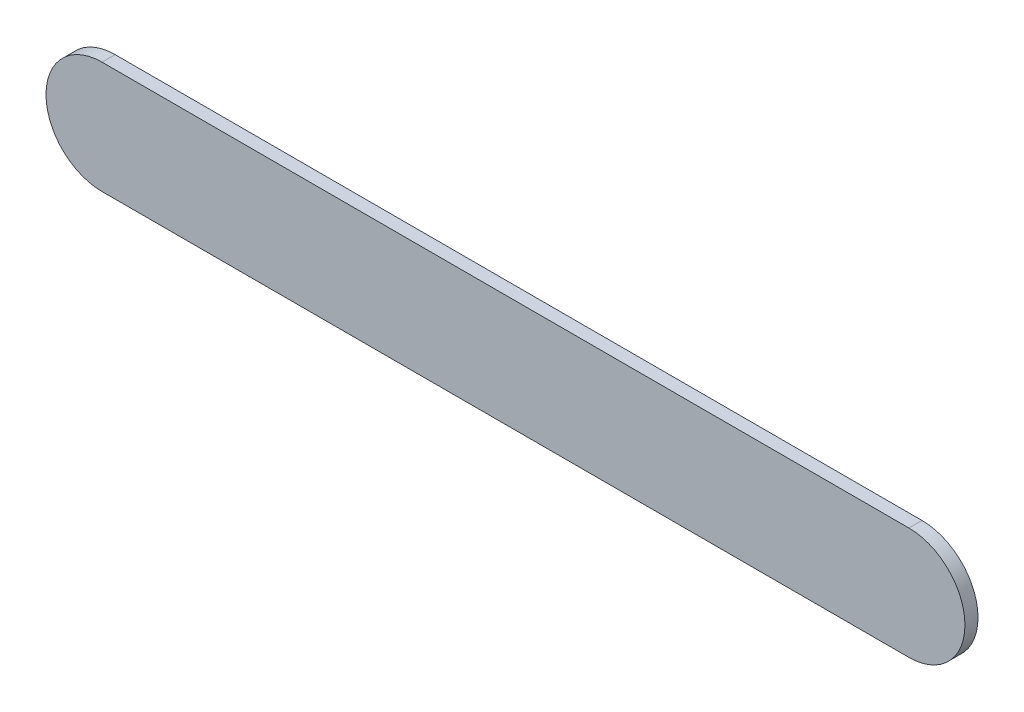
ISO-10303-21;
HEADER;
FILE_DESCRIPTION(('STEP AP214'),'2;1');
FILE_NAME('part.step','',(''),(''),'','','');
FILE_SCHEMA(('AUTOMOTIVE_DESIGN { 1 0 10303 214 1 1 1 1 }'));
ENDSEC;
DATA;
#1=APPLICATION_CONTEXT('core data for automotive mechanical design processes');
#2=APPLICATION_PROTOCOL_DEFINITION('international standard','automotive_design',2000,#1);
#3=PRODUCT_CONTEXT('',#1,'mechanical');
#4=PRODUCT('Part','Part','',(#3));
#5=PRODUCT_RELATED_PRODUCT_CATEGORY('part','',(#4));
#6=PRODUCT_DEFINITION_FORMATION('','',#4);
#7=PRODUCT_DEFINITION_CONTEXT('part definition',#1,'design');
#8=PRODUCT_DEFINITION('design','',#6,#7);
#9=PRODUCT_DEFINITION_SHAPE('','',#8);
#10=(LENGTH_UNIT() NAMED_UNIT(*) SI_UNIT(.MILLI.,.METRE.));
#11=(NAMED_UNIT(*) PLANE_ANGLE_UNIT() SI_UNIT($,.RADIAN.));
#12=(NAMED_UNIT(*) SI_UNIT($,.STERADIAN.) SOLID_ANGLE_UNIT());
#13=UNCERTAINTY_MEASURE_WITH_UNIT(LENGTH_MEASURE(1.E-05),#10,'distance_accuracy_value','');
#14=(GEOMETRIC_REPRESENTATION_CONTEXT(3) GLOBAL_UNCERTAINTY_ASSIGNED_CONTEXT((#13)) GLOBAL_UNIT_ASSIGNED_CONTEXT((#10,
#11,#12)) REPRESENTATION_CONTEXT('',''));
#15=CARTESIAN_POINT('',(0.,0.,0.));
#16=DIRECTION('',(0.,0.,1.));
#17=DIRECTION('',(1.,0.,0.));
#18=AXIS2_PLACEMENT_3D('',#15,#16,#17);
#19=CARTESIAN_POINT('',(146.5,-110.95,1.635));
#20=DIRECTION('',(0.,0.,1.));
#21=DIRECTION('',(1.,0.,0.));
#22=AXIS2_PLACEMENT_3D('',#19,#20,#21);
#23=PLANE('',#22);
#24=DIRECTION('',(-1.,0.,0.));
#25=VECTOR('',#24,1.);
#26=CARTESIAN_POINT('',(146.5,-110.95,1.635));
#27=LINE('',#26,#25);
#28=CARTESIAN_POINT('',(146.5,-110.95,1.635));
#29=VERTEX_POINT('',#28);
#30=CARTESIAN_POINT('',(144.34,-110.95,1.635));
#31=VERTEX_POINT('',#30);
#32=EDGE_CURVE('E67',#29,#31,#27,.T.);
#33=ORIENTED_EDGE('',*,*,#32,.T.);
#34=CARTESIAN_POINT('',(144.34,-111.1,1.635));
#35=DIRECTION('',(0.,0.,1.));
#36=DIRECTION('',(1.894780628694E-13,1.,0.));
#37=AXIS2_PLACEMENT_3D('',#34,#35,#36);
#38=CIRCLE('',#37,0.15);
#39=CARTESIAN_POINT('',(144.34,-111.25,1.635));
#40=VERTEX_POINT('',#39);
#41=EDGE_CURVE('E101',#31,#40,#38,.T.);
#42=ORIENTED_EDGE('',*,*,#41,.T.);
#43=DIRECTION('',(1.,0.,0.));
#44=VECTOR('',#43,1.);
#45=CARTESIAN_POINT('',(144.34,-111.25,1.635));
#46=LINE('',#45,#44);
#47=CARTESIAN_POINT('',(146.5,-111.25,1.635));
#48=VERTEX_POINT('',#47);
#49=EDGE_CURVE('E20',#40,#48,#46,.T.);
#50=ORIENTED_EDGE('',*,*,#49,.T.);
#51=CARTESIAN_POINT('',(146.5,-111.1,1.635));
#52=DIRECTION('',(0.,0.,1.));
#53=DIRECTION('',(0.,-1.,0.));
#54=AXIS2_PLACEMENT_3D('',#51,#52,#53);
#55=CIRCLE('',#54,0.15);
#56=EDGE_CURVE('E11',#48,#29,#55,.T.);
#57=ORIENTED_EDGE('',*,*,#56,.T.);
#58=EDGE_LOOP('',(#33,#42,#50,#57));
#59=FACE_BOUND('',#58,.T.);
#60=ADVANCED_FACE('F17',(#59),#23,.T.);
#61=CARTESIAN_POINT('',(146.5,-110.95,1.6));
#62=DIRECTION('',(0.,0.,1.));
#63=DIRECTION('',(1.,0.,0.));
#64=AXIS2_PLACEMENT_3D('',#61,#62,#63);
#65=PLANE('',#64);
#66=CARTESIAN_POINT('',(146.5,-111.1,1.6));
#67=DIRECTION('',(0.,0.,1.));
#68=DIRECTION('',(0.,-1.,0.));
#69=AXIS2_PLACEMENT_3D('',#66,#67,#68);
#70=CIRCLE('',#69,0.15);
#71=CARTESIAN_POINT('',(146.5,-111.25,1.6));
#72=VERTEX_POINT('',#71);
#73=CARTESIAN_POINT('',(146.5,-110.95,1.6));
#74=VERTEX_POINT('',#73);
#75=EDGE_CURVE('E26',#72,#74,#70,.T.);
#76=ORIENTED_EDGE('',*,*,#75,.F.);
#77=DIRECTION('',(1.,0.,0.));
#78=VECTOR('',#77,1.);
#79=CARTESIAN_POINT('',(144.34,-111.25,1.6));
#80=LINE('',#79,#78);
#81=CARTESIAN_POINT('',(144.34,-111.25,1.6));
#82=VERTEX_POINT('',#81);
#83=EDGE_CURVE('E104',#82,#72,#80,.T.);
#84=ORIENTED_EDGE('',*,*,#83,.F.);
#85=CARTESIAN_POINT('',(144.34,-111.1,1.6));
#86=DIRECTION('',(0.,0.,1.));
#87=DIRECTION('',(1.894780628694E-13,1.,0.));
#88=AXIS2_PLACEMENT_3D('',#85,#86,#87);
#89=CIRCLE('',#88,0.15);
#90=CARTESIAN_POINT('',(144.34,-110.95,1.6));
#91=VERTEX_POINT('',#90);
#92=EDGE_CURVE('E77',#91,#82,#89,.T.);
#93=ORIENTED_EDGE('',*,*,#92,.F.);
#94=DIRECTION('',(-1.,0.,0.));
#95=VECTOR('',#94,1.);
#96=CARTESIAN_POINT('',(146.5,-110.95,1.6));
#97=LINE('',#96,#95);
#98=EDGE_CURVE('E88',#74,#91,#97,.T.);
#99=ORIENTED_EDGE('',*,*,#98,.F.);
#100=EDGE_LOOP('',(#76,#84,#93,#99));
#101=FACE_BOUND('',#100,.T.);
#102=ADVANCED_FACE('F160',(#101),#65,.F.);
#103=CARTESIAN_POINT('',(146.5,-111.1,1.6));
#104=DIRECTION('',(0.,0.,-1.));
#105=DIRECTION('',(0.,-1.,0.));
#106=AXIS2_PLACEMENT_3D('',#103,#104,#105);
#107=CYLINDRICAL_SURFACE('',#106,0.15);
#108=ORIENTED_EDGE('',*,*,#75,.T.);
#109=DIRECTION('',(0.,0.,1.));
#110=VECTOR('',#109,1.);
#111=CARTESIAN_POINT('',(146.5,-110.95,1.6));
#112=LINE('',#111,#110);
#113=EDGE_CURVE('E71',#74,#29,#112,.T.);
#114=ORIENTED_EDGE('',*,*,#113,.T.);
#115=ORIENTED_EDGE('',*,*,#56,.F.);
#116=DIRECTION('',(0.,0.,1.));
#117=VECTOR('',#116,1.);
#118=CARTESIAN_POINT('',(146.5,-111.25,1.6));
#119=LINE('',#118,#117);
#120=EDGE_CURVE('E107',#72,#48,#119,.T.);
#121=ORIENTED_EDGE('',*,*,#120,.F.);
#122=EDGE_LOOP('',(#108,#114,#115,#121));
#123=FACE_BOUND('',#122,.T.);
#124=ADVANCED_FACE('F72',(#123),#107,.T.);
#125=CARTESIAN_POINT('',(144.34,-111.25,1.6));
#126=DIRECTION('',(0.,1.,0.));
#127=DIRECTION('',(1.,0.,0.));
#128=AXIS2_PLACEMENT_3D('',#125,#126,#127);
#129=PLANE('',#128);
#130=ORIENTED_EDGE('',*,*,#83,.T.);
#131=ORIENTED_EDGE('',*,*,#120,.T.);
#132=ORIENTED_EDGE('',*,*,#49,.F.);
#133=DIRECTION('',(0.,0.,1.));
#134=VECTOR('',#133,1.);
#135=CARTESIAN_POINT('',(144.34,-111.25,1.6));
#136=LINE('',#135,#134);
#137=EDGE_CURVE('E96',#82,#40,#136,.T.);
#138=ORIENTED_EDGE('',*,*,#137,.F.);
#139=EDGE_LOOP('',(#130,#131,#132,#138));
#140=FACE_BOUND('',#139,.T.);
#141=ADVANCED_FACE('F143',(#140),#129,.F.);
#142=CARTESIAN_POINT('',(144.34,-111.1,1.6));
#143=DIRECTION('',(0.,0.,-1.));
#144=DIRECTION('',(1.894780628694E-13,1.,0.));
#145=AXIS2_PLACEMENT_3D('',#142,#143,#144);
#146=CYLINDRICAL_SURFACE('',#145,0.15);
#147=ORIENTED_EDGE('',*,*,#92,.T.);
#148=ORIENTED_EDGE('',*,*,#137,.T.);
#149=ORIENTED_EDGE('',*,*,#41,.F.);
#150=DIRECTION('',(0.,0.,1.));
#151=VECTOR('',#150,1.);
#152=CARTESIAN_POINT('',(144.34,-110.95,1.6));
#153=LINE('',#152,#151);
#154=EDGE_CURVE('E81',#91,#31,#153,.T.);
#155=ORIENTED_EDGE('',*,*,#154,.F.);
#156=EDGE_LOOP('',(#147,#148,#149,#155));
#157=FACE_BOUND('',#156,.T.);
#158=ADVANCED_FACE('F133',(#157),#146,.T.);
#159=CARTESIAN_POINT('',(146.5,-110.95,1.6));
#160=DIRECTION('',(0.,-1.,0.));
#161=DIRECTION('',(0.,0.,-1.));
#162=AXIS2_PLACEMENT_3D('',#159,#160,#161);
#163=PLANE('',#162);
#164=ORIENTED_EDGE('',*,*,#98,.T.);
#165=ORIENTED_EDGE('',*,*,#154,.T.);
#166=ORIENTED_EDGE('',*,*,#32,.F.);
#167=ORIENTED_EDGE('',*,*,#113,.F.);
#168=EDGE_LOOP('',(#164,#165,#166,#167));
#169=FACE_BOUND('',#168,.T.);
#170=ADVANCED_FACE('F79',(#169),#163,.F.);
#171=CLOSED_SHELL('',(#60,#102,#124,#141,#158,#170));
#172=MANIFOLD_SOLID_BREP('B1',#171);
#173=ADVANCED_BREP_SHAPE_REPRESENTATION('',(#18,#172),#14);
#174=SHAPE_DEFINITION_REPRESENTATION(#9,#173);
ENDSEC;
END-ISO-10303-21;
